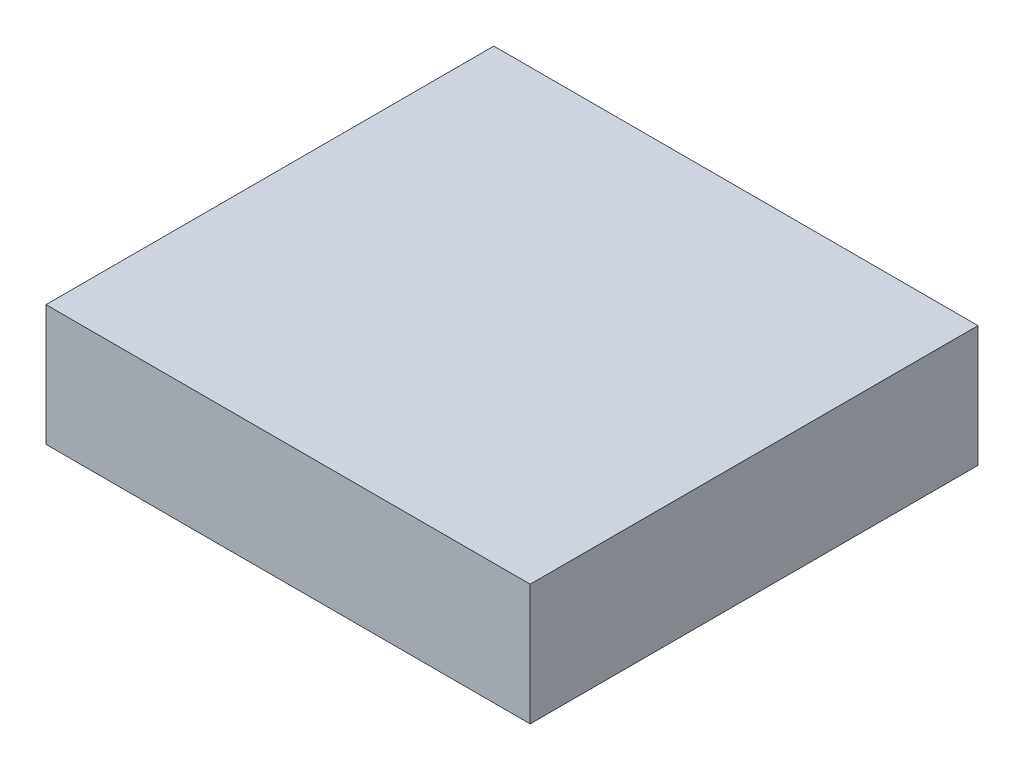
ISO-10303-21;
HEADER;
FILE_DESCRIPTION(('STEP AP214'),'2;1');
FILE_NAME('part.step','',(''),(''),'','','');
FILE_SCHEMA(('AUTOMOTIVE_DESIGN { 1 0 10303 214 1 1 1 1 }'));
ENDSEC;
DATA;
#1=APPLICATION_CONTEXT('core data for automotive mechanical design processes');
#2=APPLICATION_PROTOCOL_DEFINITION('international standard','automotive_design',2000,#1);
#3=PRODUCT_CONTEXT('',#1,'mechanical');
#4=PRODUCT('Part','Part','',(#3));
#5=PRODUCT_RELATED_PRODUCT_CATEGORY('part','',(#4));
#6=PRODUCT_DEFINITION_FORMATION('','',#4);
#7=PRODUCT_DEFINITION_CONTEXT('part definition',#1,'design');
#8=PRODUCT_DEFINITION('design','',#6,#7);
#9=PRODUCT_DEFINITION_SHAPE('','',#8);
#10=(LENGTH_UNIT() NAMED_UNIT(*) SI_UNIT(.MILLI.,.METRE.));
#11=(NAMED_UNIT(*) PLANE_ANGLE_UNIT() SI_UNIT($,.RADIAN.));
#12=(NAMED_UNIT(*) SI_UNIT($,.STERADIAN.) SOLID_ANGLE_UNIT());
#13=UNCERTAINTY_MEASURE_WITH_UNIT(LENGTH_MEASURE(1.E-05),#10,'distance_accuracy_value','');
#14=(GEOMETRIC_REPRESENTATION_CONTEXT(3) GLOBAL_UNCERTAINTY_ASSIGNED_CONTEXT((#13)) GLOBAL_UNIT_ASSIGNED_CONTEXT((#10,
#11,#12)) REPRESENTATION_CONTEXT('',''));
#15=CARTESIAN_POINT('',(0.,0.,0.));
#16=DIRECTION('',(0.,0.,1.));
#17=DIRECTION('',(1.,0.,0.));
#18=AXIS2_PLACEMENT_3D('',#15,#16,#17);
#19=CARTESIAN_POINT('',(0.,10.,0.));
#20=DIRECTION('',(1.,0.,0.));
#21=DIRECTION('',(0.,0.,-1.));
#22=AXIS2_PLACEMENT_3D('',#19,#20,#21);
#23=PLANE('',#22);
#24=DIRECTION('',(0.,0.,1.));
#25=VECTOR('',#24,1.);
#26=CARTESIAN_POINT('',(0.,0.,0.));
#27=LINE('',#26,#25);
#28=CARTESIAN_POINT('',(0.,0.,-37.));
#29=VERTEX_POINT('',#28);
#30=CARTESIAN_POINT('',(0.,0.,0.));
#31=VERTEX_POINT('',#30);
#32=EDGE_CURVE('E106',#29,#31,#27,.T.);
#33=ORIENTED_EDGE('',*,*,#32,.T.);
#34=DIRECTION('',(0.,-1.,0.));
#35=VECTOR('',#34,1.);
#36=CARTESIAN_POINT('',(0.,10.,0.));
#37=LINE('',#36,#35);
#38=CARTESIAN_POINT('',(0.,10.,0.));
#39=VERTEX_POINT('',#38);
#40=EDGE_CURVE('E11',#39,#31,#37,.T.);
#41=ORIENTED_EDGE('',*,*,#40,.F.);
#42=DIRECTION('',(0.,0.,1.));
#43=VECTOR('',#42,1.);
#44=CARTESIAN_POINT('',(0.,10.,0.));
#45=LINE('',#44,#43);
#46=CARTESIAN_POINT('',(0.,10.,-37.));
#47=VERTEX_POINT('',#46);
#48=EDGE_CURVE('E92',#47,#39,#45,.T.);
#49=ORIENTED_EDGE('',*,*,#48,.F.);
#50=DIRECTION('',(0.,-1.,0.));
#51=VECTOR('',#50,1.);
#52=CARTESIAN_POINT('',(0.,10.,-37.));
#53=LINE('',#52,#51);
#54=EDGE_CURVE('E105',#47,#29,#53,.T.);
#55=ORIENTED_EDGE('',*,*,#54,.T.);
#56=EDGE_LOOP('',(#33,#41,#49,#55));
#57=FACE_BOUND('',#56,.T.);
#58=ADVANCED_FACE('F43',(#57),#23,.F.);
#59=CARTESIAN_POINT('',(0.,10.,0.));
#60=DIRECTION('',(0.,0.,-1.));
#61=DIRECTION('',(-1.,0.,0.));
#62=AXIS2_PLACEMENT_3D('',#59,#60,#61);
#63=PLANE('',#62);
#64=DIRECTION('',(1.,0.,0.));
#65=VECTOR('',#64,1.);
#66=CARTESIAN_POINT('',(0.,0.,0.));
#67=LINE('',#66,#65);
#68=CARTESIAN_POINT('',(40.,0.,0.));
#69=VERTEX_POINT('',#68);
#70=EDGE_CURVE('E97',#31,#69,#67,.T.);
#71=ORIENTED_EDGE('',*,*,#70,.T.);
#72=DIRECTION('',(0.,-1.,0.));
#73=VECTOR('',#72,1.);
#74=CARTESIAN_POINT('',(40.,10.,0.));
#75=LINE('',#74,#73);
#76=CARTESIAN_POINT('',(40.,10.,0.));
#77=VERTEX_POINT('',#76);
#78=EDGE_CURVE('E51',#77,#69,#75,.T.);
#79=ORIENTED_EDGE('',*,*,#78,.F.);
#80=DIRECTION('',(1.,0.,0.));
#81=VECTOR('',#80,1.);
#82=CARTESIAN_POINT('',(0.,10.,0.));
#83=LINE('',#82,#81);
#84=EDGE_CURVE('E87',#39,#77,#83,.T.);
#85=ORIENTED_EDGE('',*,*,#84,.F.);
#86=ORIENTED_EDGE('',*,*,#40,.T.);
#87=EDGE_LOOP('',(#71,#79,#85,#86));
#88=FACE_BOUND('',#87,.T.);
#89=ADVANCED_FACE('F100',(#88),#63,.F.);
#90=CARTESIAN_POINT('',(40.,10.,0.));
#91=DIRECTION('',(-1.,0.,0.));
#92=DIRECTION('',(0.,0.,1.));
#93=AXIS2_PLACEMENT_3D('',#90,#91,#92);
#94=PLANE('',#93);
#95=DIRECTION('',(0.,0.,-1.));
#96=VECTOR('',#95,1.);
#97=CARTESIAN_POINT('',(40.,0.,0.));
#98=LINE('',#97,#96);
#99=CARTESIAN_POINT('',(40.,0.,-37.));
#100=VERTEX_POINT('',#99);
#101=EDGE_CURVE('E78',#69,#100,#98,.T.);
#102=ORIENTED_EDGE('',*,*,#101,.T.);
#103=DIRECTION('',(0.,-1.,0.));
#104=VECTOR('',#103,1.);
#105=CARTESIAN_POINT('',(40.,10.,-37.));
#106=LINE('',#105,#104);
#107=CARTESIAN_POINT('',(40.,10.,-37.));
#108=VERTEX_POINT('',#107);
#109=EDGE_CURVE('E98',#108,#100,#106,.T.);
#110=ORIENTED_EDGE('',*,*,#109,.F.);
#111=DIRECTION('',(0.,0.,-1.));
#112=VECTOR('',#111,1.);
#113=CARTESIAN_POINT('',(40.,10.,0.));
#114=LINE('',#113,#112);
#115=EDGE_CURVE('E95',#77,#108,#114,.T.);
#116=ORIENTED_EDGE('',*,*,#115,.F.);
#117=ORIENTED_EDGE('',*,*,#78,.T.);
#118=EDGE_LOOP('',(#102,#110,#116,#117));
#119=FACE_BOUND('',#118,.T.);
#120=ADVANCED_FACE('F99',(#119),#94,.F.);
#121=CARTESIAN_POINT('',(0.,10.,-37.));
#122=DIRECTION('',(0.,0.,1.));
#123=DIRECTION('',(1.,0.,0.));
#124=AXIS2_PLACEMENT_3D('',#121,#122,#123);
#125=PLANE('',#124);
#126=DIRECTION('',(-1.,0.,0.));
#127=VECTOR('',#126,1.);
#128=CARTESIAN_POINT('',(0.,0.,-37.));
#129=LINE('',#128,#127);
#130=EDGE_CURVE('E85',#100,#29,#129,.T.);
#131=ORIENTED_EDGE('',*,*,#130,.T.);
#132=ORIENTED_EDGE('',*,*,#54,.F.);
#133=DIRECTION('',(-1.,0.,0.));
#134=VECTOR('',#133,1.);
#135=CARTESIAN_POINT('',(0.,10.,-37.));
#136=LINE('',#135,#134);
#137=EDGE_CURVE('E56',#108,#47,#136,.T.);
#138=ORIENTED_EDGE('',*,*,#137,.F.);
#139=ORIENTED_EDGE('',*,*,#109,.T.);
#140=EDGE_LOOP('',(#131,#132,#138,#139));
#141=FACE_BOUND('',#140,.T.);
#142=ADVANCED_FACE('F111',(#141),#125,.F.);
#143=CARTESIAN_POINT('',(0.,10.,0.));
#144=DIRECTION('',(0.,-1.,0.));
#145=DIRECTION('',(0.,0.,-1.));
#146=AXIS2_PLACEMENT_3D('',#143,#144,#145);
#147=PLANE('',#146);
#148=ORIENTED_EDGE('',*,*,#48,.T.);
#149=ORIENTED_EDGE('',*,*,#84,.T.);
#150=ORIENTED_EDGE('',*,*,#115,.T.);
#151=ORIENTED_EDGE('',*,*,#137,.T.);
#152=EDGE_LOOP('',(#148,#149,#150,#151));
#153=FACE_BOUND('',#152,.T.);
#154=ADVANCED_FACE('F89',(#153),#147,.F.);
#155=CARTESIAN_POINT('',(0.,0.,0.));
#156=DIRECTION('',(0.,-1.,0.));
#157=DIRECTION('',(0.,0.,-1.));
#158=AXIS2_PLACEMENT_3D('',#155,#156,#157);
#159=PLANE('',#158);
#160=ORIENTED_EDGE('',*,*,#32,.F.);
#161=ORIENTED_EDGE('',*,*,#130,.F.);
#162=ORIENTED_EDGE('',*,*,#101,.F.);
#163=ORIENTED_EDGE('',*,*,#70,.F.);
#164=EDGE_LOOP('',(#160,#161,#162,#163));
#165=FACE_BOUND('',#164,.T.);
#166=ADVANCED_FACE('F116',(#165),#159,.T.);
#167=CLOSED_SHELL('',(#58,#89,#120,#142,#154,#166));
#168=MANIFOLD_SOLID_BREP('B2',#167);
#169=ADVANCED_BREP_SHAPE_REPRESENTATION('',(#18,#168),#14);
#170=SHAPE_DEFINITION_REPRESENTATION(#9,#169);
ENDSEC;
END-ISO-10303-21;
